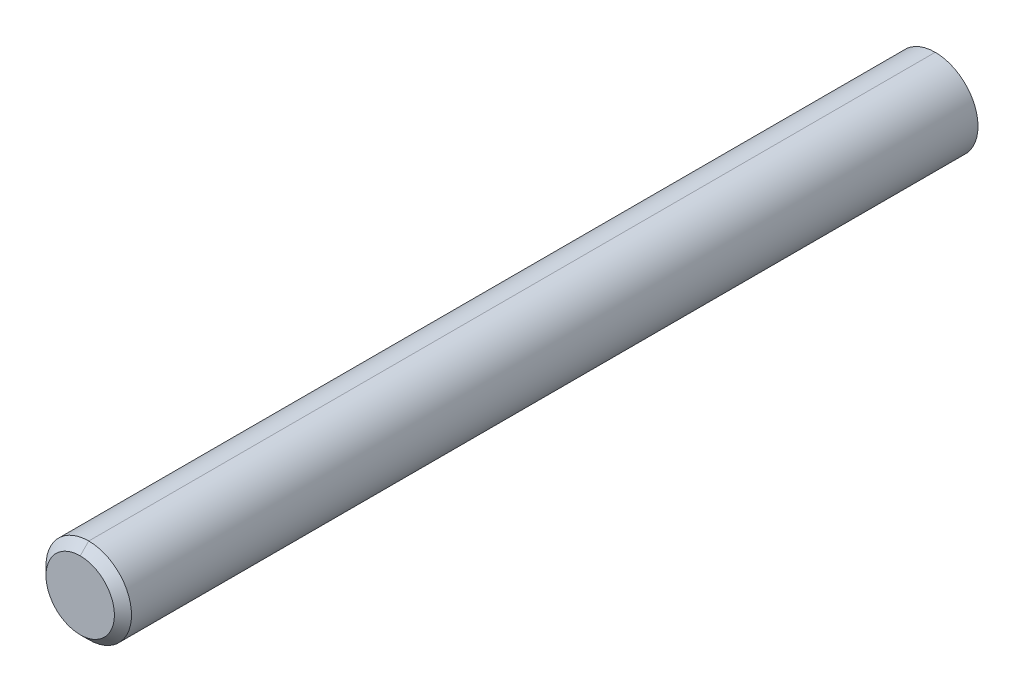
ISO-10303-21;
HEADER;
FILE_DESCRIPTION(('STEP AP214'),'2;1');
FILE_NAME('part.step','',(''),(''),'','','');
FILE_SCHEMA(('AUTOMOTIVE_DESIGN { 1 0 10303 214 1 1 1 1 }'));
ENDSEC;
DATA;
#1=APPLICATION_CONTEXT('core data for automotive mechanical design processes');
#2=APPLICATION_PROTOCOL_DEFINITION('international standard','automotive_design',2000,#1);
#3=PRODUCT_CONTEXT('',#1,'mechanical');
#4=PRODUCT('Part','Part','',(#3));
#5=PRODUCT_RELATED_PRODUCT_CATEGORY('part','',(#4));
#6=PRODUCT_DEFINITION_FORMATION('','',#4);
#7=PRODUCT_DEFINITION_CONTEXT('part definition',#1,'design');
#8=PRODUCT_DEFINITION('design','',#6,#7);
#9=PRODUCT_DEFINITION_SHAPE('','',#8);
#10=(LENGTH_UNIT() NAMED_UNIT(*) SI_UNIT(.MILLI.,.METRE.));
#11=(NAMED_UNIT(*) PLANE_ANGLE_UNIT() SI_UNIT($,.RADIAN.));
#12=(NAMED_UNIT(*) SI_UNIT($,.STERADIAN.) SOLID_ANGLE_UNIT());
#13=UNCERTAINTY_MEASURE_WITH_UNIT(LENGTH_MEASURE(1.E-05),#10,'distance_accuracy_value','');
#14=(GEOMETRIC_REPRESENTATION_CONTEXT(3) GLOBAL_UNCERTAINTY_ASSIGNED_CONTEXT((#13)) GLOBAL_UNIT_ASSIGNED_CONTEXT((#10,
#11,#12)) REPRESENTATION_CONTEXT('',''));
#15=CARTESIAN_POINT('',(0.,0.,0.));
#16=DIRECTION('',(0.,0.,1.));
#17=DIRECTION('',(1.,0.,0.));
#18=AXIS2_PLACEMENT_3D('',#15,#16,#17);
#19=CARTESIAN_POINT('',(-1.012,-1.012,0.));
#20=DIRECTION('',(0.,0.,1.));
#21=DIRECTION('',(0.,-1.,0.));
#22=AXIS2_PLACEMENT_3D('',#19,#20,#21);
#23=PLANE('',#22);
#24=CARTESIAN_POINT('',(0.,0.,0.));
#25=DIRECTION('',(0.,0.,-1.));
#26=DIRECTION('',(0.,1.,0.));
#27=AXIS2_PLACEMENT_3D('',#24,#25,#26);
#28=CIRCLE('',#27,1.);
#29=CARTESIAN_POINT('',(0.,0.999999999999953,0.));
#30=VERTEX_POINT('',#29);
#31=CARTESIAN_POINT('',(0.,-1.00000000000004,0.));
#32=VERTEX_POINT('',#31);
#33=EDGE_CURVE('E193',#30,#32,#28,.T.);
#34=ORIENTED_EDGE('',*,*,#33,.T.);
#35=CARTESIAN_POINT('',(0.,0.,0.));
#36=DIRECTION('',(0.,0.,-1.));
#37=DIRECTION('',(0.,1.,0.));
#38=AXIS2_PLACEMENT_3D('',#35,#36,#37);
#39=CIRCLE('',#38,1.);
#40=EDGE_CURVE('E10',#32,#30,#39,.T.);
#41=ORIENTED_EDGE('',*,*,#40,.T.);
#42=EDGE_LOOP('',(#34,#41));
#43=FACE_BOUND('',#42,.T.);
#44=ADVANCED_FACE('F16',(#43),#23,.F.);
#45=CARTESIAN_POINT('',(0.,0.,19.8));
#46=DIRECTION('',(0.,0.,-1.));
#47=DIRECTION('',(0.,1.,0.));
#48=AXIS2_PLACEMENT_3D('',#45,#46,#47);
#49=CYLINDRICAL_SURFACE('',#48,1.);
#50=DIRECTION('',(0.,0.,-1.));
#51=VECTOR('',#50,1.);
#52=CARTESIAN_POINT('',(0.,-1.,19.8));
#53=LINE('',#52,#51);
#54=CARTESIAN_POINT('',(0.,-1.00000000000001,19.8));
#55=VERTEX_POINT('',#54);
#56=EDGE_CURVE('E188',#55,#32,#53,.T.);
#57=ORIENTED_EDGE('',*,*,#56,.F.);
#58=CARTESIAN_POINT('',(0.,0.,19.8));
#59=DIRECTION('',(0.,0.,-1.));
#60=DIRECTION('',(-1.,0.,0.));
#61=AXIS2_PLACEMENT_3D('',#58,#59,#60);
#62=CIRCLE('',#61,1.);
#63=CARTESIAN_POINT('',(0.,0.999999999999986,19.8));
#64=VERTEX_POINT('',#63);
#65=EDGE_CURVE('E26',#55,#64,#62,.T.);
#66=ORIENTED_EDGE('',*,*,#65,.T.);
#67=DIRECTION('',(0.,0.,-1.));
#68=VECTOR('',#67,1.);
#69=CARTESIAN_POINT('',(0.,0.999999999999981,19.8));
#70=LINE('',#69,#68);
#71=EDGE_CURVE('E74',#64,#30,#70,.T.);
#72=ORIENTED_EDGE('',*,*,#71,.T.);
#73=ORIENTED_EDGE('',*,*,#40,.F.);
#74=EDGE_LOOP('',(#57,#66,#72,#73));
#75=FACE_BOUND('',#74,.T.);
#76=ADVANCED_FACE('F18',(#75),#49,.T.);
#77=CARTESIAN_POINT('',(-0.8096,-0.8096,20.));
#78=DIRECTION('',(0.,0.,1.));
#79=DIRECTION('',(0.,-1.,0.));
#80=AXIS2_PLACEMENT_3D('',#77,#78,#79);
#81=PLANE('',#80);
#82=CARTESIAN_POINT('',(0.,0.,20.));
#83=DIRECTION('',(0.,0.,1.));
#84=DIRECTION('',(0.,1.,0.));
#85=AXIS2_PLACEMENT_3D('',#82,#83,#84);
#86=CIRCLE('',#85,0.799999999999979);
#87=CARTESIAN_POINT('',(0.,0.799999999999965,20.));
#88=VERTEX_POINT('',#87);
#89=CARTESIAN_POINT('',(0.,-0.8,20.));
#90=VERTEX_POINT('',#89);
#91=EDGE_CURVE('E61',#88,#90,#86,.T.);
#92=ORIENTED_EDGE('',*,*,#91,.T.);
#93=CARTESIAN_POINT('',(0.,0.,20.));
#94=DIRECTION('',(0.,0.,1.));
#95=DIRECTION('',(0.,1.,0.));
#96=AXIS2_PLACEMENT_3D('',#93,#94,#95);
#97=CIRCLE('',#96,0.799999999999979);
#98=EDGE_CURVE('E20',#90,#88,#97,.T.);
#99=ORIENTED_EDGE('',*,*,#98,.T.);
#100=EDGE_LOOP('',(#92,#99));
#101=FACE_BOUND('',#100,.T.);
#102=ADVANCED_FACE('F71',(#101),#81,.T.);
#103=CARTESIAN_POINT('',(0.,0.,20.));
#104=DIRECTION('',(0.,0.,-1.));
#105=DIRECTION('',(0.,1.,0.));
#106=AXIS2_PLACEMENT_3D('',#103,#104,#105);
#107=CONICAL_SURFACE('',#106,0.8,0.785398163397451);
#108=DIRECTION('',(0.,-0.707106781186551,-0.707106781186545));
#109=VECTOR('',#108,1.);
#110=CARTESIAN_POINT('',(0.,-0.80000000000001,20.));
#111=LINE('',#110,#109);
#112=EDGE_CURVE('E77',#90,#55,#111,.T.);
#113=ORIENTED_EDGE('',*,*,#112,.F.);
#114=ORIENTED_EDGE('',*,*,#91,.F.);
#115=DIRECTION('',(0.,0.707106781186548,-0.707106781186548));
#116=VECTOR('',#115,1.);
#117=CARTESIAN_POINT('',(0.,0.799999999999982,20.));
#118=LINE('',#117,#116);
#119=EDGE_CURVE('E85',#88,#64,#118,.T.);
#120=ORIENTED_EDGE('',*,*,#119,.T.);
#121=ORIENTED_EDGE('',*,*,#65,.F.);
#122=EDGE_LOOP('',(#113,#114,#120,#121));
#123=FACE_BOUND('',#122,.T.);
#124=ADVANCED_FACE('F78',(#123),#107,.T.);
#125=CARTESIAN_POINT('',(0.,0.,19.8));
#126=DIRECTION('',(0.,0.,-1.));
#127=DIRECTION('',(0.,1.,0.));
#128=AXIS2_PLACEMENT_3D('',#125,#126,#127);
#129=CYLINDRICAL_SURFACE('',#128,1.);
#130=CARTESIAN_POINT('',(0.,0.,19.8));
#131=DIRECTION('',(0.,0.,-1.));
#132=DIRECTION('',(-1.,0.,0.));
#133=AXIS2_PLACEMENT_3D('',#130,#131,#132);
#134=CIRCLE('',#133,1.);
#135=EDGE_CURVE('E82',#64,#55,#134,.T.);
#136=ORIENTED_EDGE('',*,*,#135,.T.);
#137=ORIENTED_EDGE('',*,*,#56,.T.);
#138=ORIENTED_EDGE('',*,*,#33,.F.);
#139=ORIENTED_EDGE('',*,*,#71,.F.);
#140=EDGE_LOOP('',(#136,#137,#138,#139));
#141=FACE_BOUND('',#140,.T.);
#142=ADVANCED_FACE('F98',(#141),#129,.T.);
#143=CARTESIAN_POINT('',(0.,0.,20.));
#144=DIRECTION('',(0.,0.,-1.));
#145=DIRECTION('',(0.,1.,0.));
#146=AXIS2_PLACEMENT_3D('',#143,#144,#145);
#147=CONICAL_SURFACE('',#146,0.8,0.785398163397451);
#148=ORIENTED_EDGE('',*,*,#98,.F.);
#149=ORIENTED_EDGE('',*,*,#112,.T.);
#150=ORIENTED_EDGE('',*,*,#135,.F.);
#151=ORIENTED_EDGE('',*,*,#119,.F.);
#152=EDGE_LOOP('',(#148,#149,#150,#151));
#153=FACE_BOUND('',#152,.T.);
#154=ADVANCED_FACE('F84',(#153),#147,.T.);
#155=CLOSED_SHELL('',(#44,#76,#102,#124,#142,#154));
#156=MANIFOLD_SOLID_BREP('B1',#155);
#157=ADVANCED_BREP_SHAPE_REPRESENTATION('',(#18,#156),#14);
#158=SHAPE_DEFINITION_REPRESENTATION(#9,#157);
ENDSEC;
END-ISO-10303-21;
